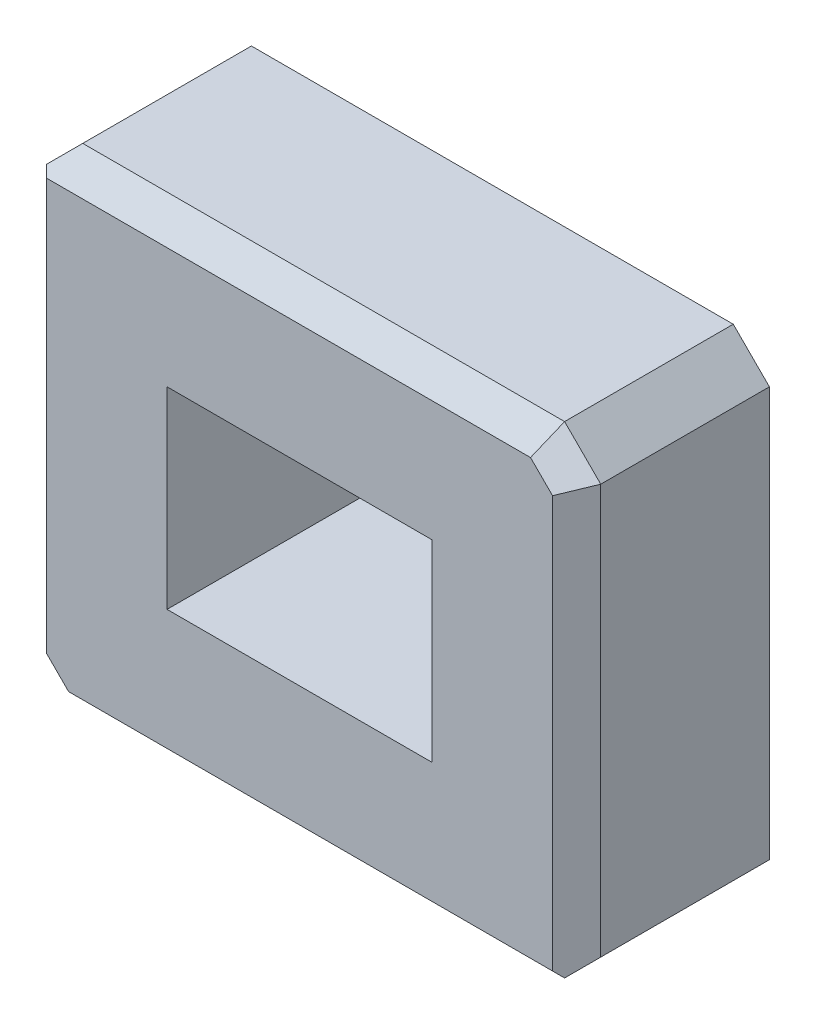
ISO-10303-21;
HEADER;
FILE_DESCRIPTION(('STEP AP214'),'2;1');
FILE_NAME('part.step','',(''),(''),'','','');
FILE_SCHEMA(('AUTOMOTIVE_DESIGN { 1 0 10303 214 1 1 1 1 }'));
ENDSEC;
DATA;
#1=APPLICATION_CONTEXT('core data for automotive mechanical design processes');
#2=APPLICATION_PROTOCOL_DEFINITION('international standard','automotive_design',2000,#1);
#3=PRODUCT_CONTEXT('',#1,'mechanical');
#4=PRODUCT('Part','Part','',(#3));
#5=PRODUCT_RELATED_PRODUCT_CATEGORY('part','',(#4));
#6=PRODUCT_DEFINITION_FORMATION('','',#4);
#7=PRODUCT_DEFINITION_CONTEXT('part definition',#1,'design');
#8=PRODUCT_DEFINITION('design','',#6,#7);
#9=PRODUCT_DEFINITION_SHAPE('','',#8);
#10=(LENGTH_UNIT() NAMED_UNIT(*) SI_UNIT(.MILLI.,.METRE.));
#11=(NAMED_UNIT(*) PLANE_ANGLE_UNIT() SI_UNIT($,.RADIAN.));
#12=(NAMED_UNIT(*) SI_UNIT($,.STERADIAN.) SOLID_ANGLE_UNIT());
#13=UNCERTAINTY_MEASURE_WITH_UNIT(LENGTH_MEASURE(1.E-05),#10,'distance_accuracy_value','');
#14=(GEOMETRIC_REPRESENTATION_CONTEXT(3) GLOBAL_UNCERTAINTY_ASSIGNED_CONTEXT((#13)) GLOBAL_UNIT_ASSIGNED_CONTEXT((#10,
#11,#12)) REPRESENTATION_CONTEXT('',''));
#15=CARTESIAN_POINT('',(0.,0.,0.));
#16=DIRECTION('',(0.,0.,1.));
#17=DIRECTION('',(1.,0.,0.));
#18=AXIS2_PLACEMENT_3D('',#15,#16,#17);
#19=CARTESIAN_POINT('',(-11.5,-8.5,8.));
#20=DIRECTION('',(1.,0.,0.));
#21=DIRECTION('',(0.,0.,-1.));
#22=AXIS2_PLACEMENT_3D('',#19,#20,#21);
#23=PLANE('',#22);
#24=DIRECTION('',(0.,0.,-1.));
#25=VECTOR('',#24,1.);
#26=CARTESIAN_POINT('',(-11.5,-8.5,8.));
#27=LINE('',#26,#25);
#28=CARTESIAN_POINT('',(-11.5,-8.5,7.));
#29=VERTEX_POINT('',#28);
#30=CARTESIAN_POINT('',(-11.5,-8.5,0.));
#31=VERTEX_POINT('',#30);
#32=EDGE_CURVE('E231',#29,#31,#27,.T.);
#33=ORIENTED_EDGE('',*,*,#32,.F.);
#34=DIRECTION('',(0.,1.,0.));
#35=VECTOR('',#34,1.);
#36=CARTESIAN_POINT('',(-11.5,-8.5,7.));
#37=LINE('',#36,#35);
#38=CARTESIAN_POINT('',(-11.5,8.5,7.));
#39=VERTEX_POINT('',#38);
#40=EDGE_CURVE('E246',#29,#39,#37,.T.);
#41=ORIENTED_EDGE('',*,*,#40,.T.);
#42=DIRECTION('',(0.,0.,-1.));
#43=VECTOR('',#42,1.);
#44=CARTESIAN_POINT('',(-11.5,8.5,8.));
#45=LINE('',#44,#43);
#46=CARTESIAN_POINT('',(-11.5,8.5,0.));
#47=VERTEX_POINT('',#46);
#48=EDGE_CURVE('E217',#39,#47,#45,.T.);
#49=ORIENTED_EDGE('',*,*,#48,.T.);
#50=DIRECTION('',(0.,-1.,0.));
#51=VECTOR('',#50,1.);
#52=CARTESIAN_POINT('',(-11.5,-8.5,0.));
#53=LINE('',#52,#51);
#54=EDGE_CURVE('E190',#47,#31,#53,.T.);
#55=ORIENTED_EDGE('',*,*,#54,.T.);
#56=EDGE_LOOP('',(#33,#41,#49,#55));
#57=FACE_BOUND('',#56,.T.);
#58=ADVANCED_FACE('F36',(#57),#23,.F.);
#59=CARTESIAN_POINT('',(-11.5,-8.5,8.));
#60=DIRECTION('',(0.707106781186547,0.707106781186547,0.));
#61=DIRECTION('',(-0.707106781186548,0.707106781186548,0.));
#62=AXIS2_PLACEMENT_3D('',#59,#60,#61);
#63=PLANE('',#62);
#64=DIRECTION('',(0.,0.,-1.));
#65=VECTOR('',#64,1.);
#66=CARTESIAN_POINT('',(-10.,-10.,8.));
#67=LINE('',#66,#65);
#68=CARTESIAN_POINT('',(-10.,-10.,7.));
#69=VERTEX_POINT('',#68);
#70=CARTESIAN_POINT('',(-10.,-10.,0.));
#71=VERTEX_POINT('',#70);
#72=EDGE_CURVE('E229',#69,#71,#67,.T.);
#73=ORIENTED_EDGE('',*,*,#72,.F.);
#74=DIRECTION('',(-0.707106781186548,0.707106781186548,0.));
#75=VECTOR('',#74,1.);
#76=CARTESIAN_POINT('',(-11.5,-8.5,7.));
#77=LINE('',#76,#75);
#78=EDGE_CURVE('E253',#69,#29,#77,.T.);
#79=ORIENTED_EDGE('',*,*,#78,.T.);
#80=ORIENTED_EDGE('',*,*,#32,.T.);
#81=DIRECTION('',(0.707106781186548,-0.707106781186548,0.));
#82=VECTOR('',#81,1.);
#83=CARTESIAN_POINT('',(-11.5,-8.5,0.));
#84=LINE('',#83,#82);
#85=EDGE_CURVE('E196',#31,#71,#84,.T.);
#86=ORIENTED_EDGE('',*,*,#85,.T.);
#87=EDGE_LOOP('',(#73,#79,#80,#86));
#88=FACE_BOUND('',#87,.T.);
#89=ADVANCED_FACE('F332',(#88),#63,.F.);
#90=CARTESIAN_POINT('',(-10.,-10.,8.));
#91=DIRECTION('',(0.,1.,0.));
#92=DIRECTION('',(0.,0.,1.));
#93=AXIS2_PLACEMENT_3D('',#90,#91,#92);
#94=PLANE('',#93);
#95=DIRECTION('',(0.,0.,-1.));
#96=VECTOR('',#95,1.);
#97=CARTESIAN_POINT('',(10.,-10.,8.));
#98=LINE('',#97,#96);
#99=CARTESIAN_POINT('',(10.,-10.,7.));
#100=VERTEX_POINT('',#99);
#101=CARTESIAN_POINT('',(10.,-10.,0.));
#102=VERTEX_POINT('',#101);
#103=EDGE_CURVE('E227',#100,#102,#98,.T.);
#104=ORIENTED_EDGE('',*,*,#103,.F.);
#105=DIRECTION('',(-1.,0.,0.));
#106=VECTOR('',#105,1.);
#107=CARTESIAN_POINT('',(-10.,-10.,7.));
#108=LINE('',#107,#106);
#109=EDGE_CURVE('E259',#100,#69,#108,.T.);
#110=ORIENTED_EDGE('',*,*,#109,.T.);
#111=ORIENTED_EDGE('',*,*,#72,.T.);
#112=DIRECTION('',(1.,0.,0.));
#113=VECTOR('',#112,1.);
#114=CARTESIAN_POINT('',(-10.,-10.,0.));
#115=LINE('',#114,#113);
#116=EDGE_CURVE('E199',#71,#102,#115,.T.);
#117=ORIENTED_EDGE('',*,*,#116,.T.);
#118=EDGE_LOOP('',(#104,#110,#111,#117));
#119=FACE_BOUND('',#118,.T.);
#120=ADVANCED_FACE('F339',(#119),#94,.F.);
#121=CARTESIAN_POINT('',(10.,-10.,8.));
#122=DIRECTION('',(-0.707106781186547,0.707106781186547,0.));
#123=DIRECTION('',(-0.707106781186548,-0.707106781186548,0.));
#124=AXIS2_PLACEMENT_3D('',#121,#122,#123);
#125=PLANE('',#124);
#126=DIRECTION('',(0.577350269189626,0.577350269189626,-0.577350269189626));
#127=VECTOR('',#126,1.);
#128=CARTESIAN_POINT('',(13.6666666666667,-6.33333333333334,4.83333333333333));
#129=LINE('',#128,#127);
#130=CARTESIAN_POINT('',(11.5,-8.5,6.99999999999999));
#131=VERTEX_POINT('',#130);
#132=CARTESIAN_POINT('',(10.75,-9.25000000000001,7.74999999999999));
#133=VERTEX_POINT('',#132);
#134=EDGE_CURVE('E255',#131,#133,#129,.F.);
#135=ORIENTED_EDGE('',*,*,#134,.T.);
#136=DIRECTION('',(0.577350269189625,0.577350269189625,0.577350269189627));
#137=VECTOR('',#136,1.);
#138=CARTESIAN_POINT('',(7.33333333333334,-12.6666666666667,4.33333333333333));
#139=LINE('',#138,#137);
#140=EDGE_CURVE('E257',#133,#100,#139,.F.);
#141=ORIENTED_EDGE('',*,*,#140,.T.);
#142=ORIENTED_EDGE('',*,*,#103,.T.);
#143=DIRECTION('',(0.707106781186548,0.707106781186548,0.));
#144=VECTOR('',#143,1.);
#145=CARTESIAN_POINT('',(10.,-10.,0.));
#146=LINE('',#145,#144);
#147=CARTESIAN_POINT('',(11.5,-8.5,0.));
#148=VERTEX_POINT('',#147);
#149=EDGE_CURVE('E202',#102,#148,#146,.T.);
#150=ORIENTED_EDGE('',*,*,#149,.T.);
#151=DIRECTION('',(0.,0.,-1.));
#152=VECTOR('',#151,1.);
#153=CARTESIAN_POINT('',(11.5,-8.5,8.));
#154=LINE('',#153,#152);
#155=EDGE_CURVE('E225',#131,#148,#154,.T.);
#156=ORIENTED_EDGE('',*,*,#155,.F.);
#157=EDGE_LOOP('',(#135,#141,#142,#150,#156));
#158=FACE_BOUND('',#157,.T.);
#159=ADVANCED_FACE('F294',(#158),#125,.F.);
#160=CARTESIAN_POINT('',(11.5,-8.5,8.));
#161=DIRECTION('',(-1.,0.,0.));
#162=DIRECTION('',(0.,0.,1.));
#163=AXIS2_PLACEMENT_3D('',#160,#161,#162);
#164=PLANE('',#163);
#165=DIRECTION('',(0.,0.,-1.));
#166=VECTOR('',#165,1.);
#167=CARTESIAN_POINT('',(11.5,8.5,8.));
#168=LINE('',#167,#166);
#169=CARTESIAN_POINT('',(11.5,8.5,6.99999999999999));
#170=VERTEX_POINT('',#169);
#171=CARTESIAN_POINT('',(11.5,8.5,0.));
#172=VERTEX_POINT('',#171);
#173=EDGE_CURVE('E223',#170,#172,#168,.T.);
#174=ORIENTED_EDGE('',*,*,#173,.F.);
#175=DIRECTION('',(0.,-1.,0.));
#176=VECTOR('',#175,1.);
#177=CARTESIAN_POINT('',(11.5,-8.5,6.99999999999999));
#178=LINE('',#177,#176);
#179=EDGE_CURVE('E261',#170,#131,#178,.T.);
#180=ORIENTED_EDGE('',*,*,#179,.T.);
#181=ORIENTED_EDGE('',*,*,#155,.T.);
#182=DIRECTION('',(0.,1.,0.));
#183=VECTOR('',#182,1.);
#184=CARTESIAN_POINT('',(11.5,-8.5,0.));
#185=LINE('',#184,#183);
#186=EDGE_CURVE('E205',#148,#172,#185,.T.);
#187=ORIENTED_EDGE('',*,*,#186,.T.);
#188=EDGE_LOOP('',(#174,#180,#181,#187));
#189=FACE_BOUND('',#188,.T.);
#190=ADVANCED_FACE('F292',(#189),#164,.F.);
#191=CARTESIAN_POINT('',(10.,10.,8.));
#192=DIRECTION('',(-0.707106781186547,-0.707106781186547,0.));
#193=DIRECTION('',(0.707106781186548,-0.707106781186548,0.));
#194=AXIS2_PLACEMENT_3D('',#191,#192,#193);
#195=PLANE('',#194);
#196=DIRECTION('',(0.,0.,-1.));
#197=VECTOR('',#196,1.);
#198=CARTESIAN_POINT('',(10.,10.,8.));
#199=LINE('',#198,#197);
#200=CARTESIAN_POINT('',(10.,10.,6.99999999999999));
#201=VERTEX_POINT('',#200);
#202=CARTESIAN_POINT('',(10.,10.,0.));
#203=VERTEX_POINT('',#202);
#204=EDGE_CURVE('E221',#201,#203,#199,.T.);
#205=ORIENTED_EDGE('',*,*,#204,.F.);
#206=DIRECTION('',(0.707106781186548,-0.707106781186548,0.));
#207=VECTOR('',#206,1.);
#208=CARTESIAN_POINT('',(10.,10.,6.99999999999999));
#209=LINE('',#208,#207);
#210=EDGE_CURVE('E46',#201,#170,#209,.T.);
#211=ORIENTED_EDGE('',*,*,#210,.T.);
#212=ORIENTED_EDGE('',*,*,#173,.T.);
#213=DIRECTION('',(-0.707106781186548,0.707106781186548,0.));
#214=VECTOR('',#213,1.);
#215=CARTESIAN_POINT('',(10.,10.,0.));
#216=LINE('',#215,#214);
#217=EDGE_CURVE('E208',#172,#203,#216,.T.);
#218=ORIENTED_EDGE('',*,*,#217,.T.);
#219=EDGE_LOOP('',(#205,#211,#212,#218));
#220=FACE_BOUND('',#219,.T.);
#221=ADVANCED_FACE('F303',(#220),#195,.F.);
#222=CARTESIAN_POINT('',(-10.,10.,8.));
#223=DIRECTION('',(0.,-1.,0.));
#224=DIRECTION('',(0.,0.,-1.));
#225=AXIS2_PLACEMENT_3D('',#222,#223,#224);
#226=PLANE('',#225);
#227=DIRECTION('',(0.,0.,-1.));
#228=VECTOR('',#227,1.);
#229=CARTESIAN_POINT('',(-10.,10.,8.));
#230=LINE('',#229,#228);
#231=CARTESIAN_POINT('',(-10.,10.,6.99999999999999));
#232=VERTEX_POINT('',#231);
#233=CARTESIAN_POINT('',(-10.,10.,0.));
#234=VERTEX_POINT('',#233);
#235=EDGE_CURVE('E219',#232,#234,#230,.T.);
#236=ORIENTED_EDGE('',*,*,#235,.F.);
#237=DIRECTION('',(1.,0.,0.));
#238=VECTOR('',#237,1.);
#239=CARTESIAN_POINT('',(-10.,10.,6.99999999999999));
#240=LINE('',#239,#238);
#241=EDGE_CURVE('E11',#232,#201,#240,.T.);
#242=ORIENTED_EDGE('',*,*,#241,.T.);
#243=ORIENTED_EDGE('',*,*,#204,.T.);
#244=DIRECTION('',(-1.,0.,0.));
#245=VECTOR('',#244,1.);
#246=CARTESIAN_POINT('',(-10.,10.,0.));
#247=LINE('',#246,#245);
#248=EDGE_CURVE('E211',#203,#234,#247,.T.);
#249=ORIENTED_EDGE('',*,*,#248,.T.);
#250=EDGE_LOOP('',(#236,#242,#243,#249));
#251=FACE_BOUND('',#250,.T.);
#252=ADVANCED_FACE('F304',(#251),#226,.F.);
#253=CARTESIAN_POINT('',(-11.5,8.5,8.));
#254=DIRECTION('',(0.707106781186547,-0.707106781186547,0.));
#255=DIRECTION('',(0.707106781186548,0.707106781186548,0.));
#256=AXIS2_PLACEMENT_3D('',#253,#254,#255);
#257=PLANE('',#256);
#258=ORIENTED_EDGE('',*,*,#48,.F.);
#259=DIRECTION('',(-0.577350269189625,-0.577350269189625,-0.577350269189627));
#260=VECTOR('',#259,1.);
#261=CARTESIAN_POINT('',(-13.6666666666667,6.33333333333334,4.83333333333333));
#262=LINE('',#261,#260);
#263=CARTESIAN_POINT('',(-10.75,9.25,7.75));
#264=VERTEX_POINT('',#263);
#265=EDGE_CURVE('E251',#39,#264,#262,.F.);
#266=ORIENTED_EDGE('',*,*,#265,.T.);
#267=DIRECTION('',(-0.577350269189626,-0.577350269189626,0.577350269189626));
#268=VECTOR('',#267,1.);
#269=CARTESIAN_POINT('',(-7.33333333333334,12.6666666666667,4.33333333333333));
#270=LINE('',#269,#268);
#271=EDGE_CURVE('E249',#264,#232,#270,.F.);
#272=ORIENTED_EDGE('',*,*,#271,.T.);
#273=ORIENTED_EDGE('',*,*,#235,.T.);
#274=DIRECTION('',(-0.707106781186548,-0.707106781186548,0.));
#275=VECTOR('',#274,1.);
#276=CARTESIAN_POINT('',(-11.5,8.5,0.));
#277=LINE('',#276,#275);
#278=EDGE_CURVE('E214',#234,#47,#277,.T.);
#279=ORIENTED_EDGE('',*,*,#278,.T.);
#280=EDGE_LOOP('',(#258,#266,#272,#273,#279));
#281=FACE_BOUND('',#280,.T.);
#282=ADVANCED_FACE('F308',(#281),#257,.F.);
#283=CARTESIAN_POINT('',(0.,0.,8.));
#284=DIRECTION('',(0.,0.,-1.));
#285=DIRECTION('',(-1.,0.,0.));
#286=AXIS2_PLACEMENT_3D('',#283,#284,#285);
#287=PLANE('',#286);
#288=DIRECTION('',(-1.,0.,0.));
#289=VECTOR('',#288,1.);
#290=CARTESIAN_POINT('',(0.,8.99999999999999,8.));
#291=LINE('',#290,#289);
#292=CARTESIAN_POINT('',(9.5857864376269,8.99999999999999,8.));
#293=VERTEX_POINT('',#292);
#294=CARTESIAN_POINT('',(-10.5,8.99999999999999,8.));
#295=VERTEX_POINT('',#294);
#296=EDGE_CURVE('E233',#293,#295,#291,.T.);
#297=ORIENTED_EDGE('',*,*,#296,.T.);
#298=DIRECTION('',(0.,-1.,0.));
#299=VECTOR('',#298,1.);
#300=CARTESIAN_POINT('',(-10.5,0.,8.));
#301=LINE('',#300,#299);
#302=CARTESIAN_POINT('',(-10.5,-8.08578643762691,8.));
#303=VERTEX_POINT('',#302);
#304=EDGE_CURVE('E243',#295,#303,#301,.T.);
#305=ORIENTED_EDGE('',*,*,#304,.T.);
#306=DIRECTION('',(0.707106781186548,-0.707106781186548,0.));
#307=VECTOR('',#306,1.);
#308=CARTESIAN_POINT('',(-9.29289321881345,-9.29289321881345,8.));
#309=LINE('',#308,#307);
#310=CARTESIAN_POINT('',(-9.58578643762691,-9.,8.));
#311=VERTEX_POINT('',#310);
#312=EDGE_CURVE('E241',#303,#311,#309,.T.);
#313=ORIENTED_EDGE('',*,*,#312,.T.);
#314=DIRECTION('',(1.,0.,0.));
#315=VECTOR('',#314,1.);
#316=CARTESIAN_POINT('',(0.,-9.,8.));
#317=LINE('',#316,#315);
#318=CARTESIAN_POINT('',(10.5,-9.,8.));
#319=VERTEX_POINT('',#318);
#320=EDGE_CURVE('E239',#311,#319,#317,.T.);
#321=ORIENTED_EDGE('',*,*,#320,.T.);
#322=DIRECTION('',(0.,1.,0.));
#323=VECTOR('',#322,1.);
#324=CARTESIAN_POINT('',(10.5,0.,8.));
#325=LINE('',#324,#323);
#326=CARTESIAN_POINT('',(10.5,8.0857864376269,8.));
#327=VERTEX_POINT('',#326);
#328=EDGE_CURVE('E237',#319,#327,#325,.T.);
#329=ORIENTED_EDGE('',*,*,#328,.T.);
#330=DIRECTION('',(-0.707106781186548,0.707106781186548,0.));
#331=VECTOR('',#330,1.);
#332=CARTESIAN_POINT('',(9.29289321881344,9.29289321881344,8.));
#333=LINE('',#332,#331);
#334=EDGE_CURVE('E235',#327,#293,#333,.T.);
#335=ORIENTED_EDGE('',*,*,#334,.T.);
#336=EDGE_LOOP('',(#297,#305,#313,#321,#329,#335));
#337=FACE_BOUND('',#336,.T.);
#338=DIRECTION('',(-1.,0.,0.));
#339=VECTOR('',#338,1.);
#340=CARTESIAN_POINT('',(-5.5,4.,8.));
#341=LINE('',#340,#339);
#342=CARTESIAN_POINT('',(5.5,4.,8.));
#343=VERTEX_POINT('',#342);
#344=CARTESIAN_POINT('',(-5.5,4.,8.));
#345=VERTEX_POINT('',#344);
#346=EDGE_CURVE('E184',#343,#345,#341,.T.);
#347=ORIENTED_EDGE('',*,*,#346,.F.);
#348=DIRECTION('',(0.,1.,0.));
#349=VECTOR('',#348,1.);
#350=CARTESIAN_POINT('',(5.5,-4.,8.));
#351=LINE('',#350,#349);
#352=CARTESIAN_POINT('',(5.5,-4.,8.));
#353=VERTEX_POINT('',#352);
#354=EDGE_CURVE('E157',#353,#343,#351,.T.);
#355=ORIENTED_EDGE('',*,*,#354,.F.);
#356=DIRECTION('',(1.,0.,0.));
#357=VECTOR('',#356,1.);
#358=CARTESIAN_POINT('',(-5.5,-4.,8.));
#359=LINE('',#358,#357);
#360=CARTESIAN_POINT('',(-5.5,-4.,8.));
#361=VERTEX_POINT('',#360);
#362=EDGE_CURVE('E175',#361,#353,#359,.T.);
#363=ORIENTED_EDGE('',*,*,#362,.F.);
#364=DIRECTION('',(0.,-1.,0.));
#365=VECTOR('',#364,1.);
#366=CARTESIAN_POINT('',(-5.5,-4.,8.));
#367=LINE('',#366,#365);
#368=EDGE_CURVE('E178',#345,#361,#367,.T.);
#369=ORIENTED_EDGE('',*,*,#368,.F.);
#370=EDGE_LOOP('',(#347,#355,#363,#369));
#371=FACE_BOUND('',#370,.T.);
#372=ADVANCED_FACE('F321',(#337,#371),#287,.F.);
#373=CARTESIAN_POINT('',(0.,0.,0.));
#374=DIRECTION('',(0.,0.,-1.));
#375=DIRECTION('',(-1.,0.,0.));
#376=AXIS2_PLACEMENT_3D('',#373,#374,#375);
#377=PLANE('',#376);
#378=DIRECTION('',(0.,1.,0.));
#379=VECTOR('',#378,1.);
#380=CARTESIAN_POINT('',(5.5,-4.,0.));
#381=LINE('',#380,#379);
#382=CARTESIAN_POINT('',(5.5,-4.,0.));
#383=VERTEX_POINT('',#382);
#384=CARTESIAN_POINT('',(5.5,4.,0.));
#385=VERTEX_POINT('',#384);
#386=EDGE_CURVE('E154',#383,#385,#381,.T.);
#387=ORIENTED_EDGE('',*,*,#386,.T.);
#388=DIRECTION('',(-1.,0.,0.));
#389=VECTOR('',#388,1.);
#390=CARTESIAN_POINT('',(-5.5,4.,0.));
#391=LINE('',#390,#389);
#392=CARTESIAN_POINT('',(-5.5,4.,0.));
#393=VERTEX_POINT('',#392);
#394=EDGE_CURVE('E166',#385,#393,#391,.T.);
#395=ORIENTED_EDGE('',*,*,#394,.T.);
#396=DIRECTION('',(0.,-1.,0.));
#397=VECTOR('',#396,1.);
#398=CARTESIAN_POINT('',(-5.5,-4.,0.));
#399=LINE('',#398,#397);
#400=CARTESIAN_POINT('',(-5.5,-4.,0.));
#401=VERTEX_POINT('',#400);
#402=EDGE_CURVE('E170',#393,#401,#399,.T.);
#403=ORIENTED_EDGE('',*,*,#402,.T.);
#404=DIRECTION('',(1.,0.,0.));
#405=VECTOR('',#404,1.);
#406=CARTESIAN_POINT('',(-5.5,-4.,0.));
#407=LINE('',#406,#405);
#408=EDGE_CURVE('E162',#401,#383,#407,.T.);
#409=ORIENTED_EDGE('',*,*,#408,.T.);
#410=EDGE_LOOP('',(#387,#395,#403,#409));
#411=FACE_BOUND('',#410,.T.);
#412=ORIENTED_EDGE('',*,*,#54,.F.);
#413=ORIENTED_EDGE('',*,*,#278,.F.);
#414=ORIENTED_EDGE('',*,*,#248,.F.);
#415=ORIENTED_EDGE('',*,*,#217,.F.);
#416=ORIENTED_EDGE('',*,*,#186,.F.);
#417=ORIENTED_EDGE('',*,*,#149,.F.);
#418=ORIENTED_EDGE('',*,*,#116,.F.);
#419=ORIENTED_EDGE('',*,*,#85,.F.);
#420=EDGE_LOOP('',(#412,#413,#414,#415,#416,#417,#418,#419));
#421=FACE_BOUND('',#420,.T.);
#422=ADVANCED_FACE('F172',(#411,#421),#377,.T.);
#423=CARTESIAN_POINT('',(5.5,-4.,0.));
#424=DIRECTION('',(1.,0.,0.));
#425=DIRECTION('',(0.,0.,-1.));
#426=AXIS2_PLACEMENT_3D('',#423,#424,#425);
#427=PLANE('',#426);
#428=ORIENTED_EDGE('',*,*,#354,.T.);
#429=DIRECTION('',(0.,0.,1.));
#430=VECTOR('',#429,1.);
#431=CARTESIAN_POINT('',(5.5,4.,0.));
#432=LINE('',#431,#430);
#433=EDGE_CURVE('E150',#385,#343,#432,.T.);
#434=ORIENTED_EDGE('',*,*,#433,.F.);
#435=ORIENTED_EDGE('',*,*,#386,.F.);
#436=DIRECTION('',(0.,0.,1.));
#437=VECTOR('',#436,1.);
#438=CARTESIAN_POINT('',(5.5,-4.,0.));
#439=LINE('',#438,#437);
#440=EDGE_CURVE('E188',#383,#353,#439,.T.);
#441=ORIENTED_EDGE('',*,*,#440,.T.);
#442=EDGE_LOOP('',(#428,#434,#435,#441));
#443=FACE_BOUND('',#442,.T.);
#444=ADVANCED_FACE('F152',(#443),#427,.F.);
#445=CARTESIAN_POINT('',(-5.5,-4.,0.));
#446=DIRECTION('',(0.,-1.,0.));
#447=DIRECTION('',(0.,0.,-1.));
#448=AXIS2_PLACEMENT_3D('',#445,#446,#447);
#449=PLANE('',#448);
#450=ORIENTED_EDGE('',*,*,#362,.T.);
#451=ORIENTED_EDGE('',*,*,#440,.F.);
#452=ORIENTED_EDGE('',*,*,#408,.F.);
#453=DIRECTION('',(0.,0.,1.));
#454=VECTOR('',#453,1.);
#455=CARTESIAN_POINT('',(-5.5,-4.,0.));
#456=LINE('',#455,#454);
#457=EDGE_CURVE('E191',#401,#361,#456,.T.);
#458=ORIENTED_EDGE('',*,*,#457,.T.);
#459=EDGE_LOOP('',(#450,#451,#452,#458));
#460=FACE_BOUND('',#459,.T.);
#461=ADVANCED_FACE('F377',(#460),#449,.F.);
#462=CARTESIAN_POINT('',(-5.5,-4.,0.));
#463=DIRECTION('',(-1.,0.,0.));
#464=DIRECTION('',(0.,0.,1.));
#465=AXIS2_PLACEMENT_3D('',#462,#463,#464);
#466=PLANE('',#465);
#467=ORIENTED_EDGE('',*,*,#368,.T.);
#468=ORIENTED_EDGE('',*,*,#457,.F.);
#469=ORIENTED_EDGE('',*,*,#402,.F.);
#470=DIRECTION('',(0.,0.,1.));
#471=VECTOR('',#470,1.);
#472=CARTESIAN_POINT('',(-5.5,4.,0.));
#473=LINE('',#472,#471);
#474=EDGE_CURVE('E161',#393,#345,#473,.T.);
#475=ORIENTED_EDGE('',*,*,#474,.T.);
#476=EDGE_LOOP('',(#467,#468,#469,#475));
#477=FACE_BOUND('',#476,.T.);
#478=ADVANCED_FACE('F372',(#477),#466,.F.);
#479=CARTESIAN_POINT('',(-5.5,4.,0.));
#480=DIRECTION('',(0.,1.,0.));
#481=DIRECTION('',(0.,0.,1.));
#482=AXIS2_PLACEMENT_3D('',#479,#480,#481);
#483=PLANE('',#482);
#484=ORIENTED_EDGE('',*,*,#346,.T.);
#485=ORIENTED_EDGE('',*,*,#474,.F.);
#486=ORIENTED_EDGE('',*,*,#394,.F.);
#487=ORIENTED_EDGE('',*,*,#433,.T.);
#488=EDGE_LOOP('',(#484,#485,#486,#487));
#489=FACE_BOUND('',#488,.T.);
#490=ADVANCED_FACE('F167',(#489),#483,.F.);
#491=CARTESIAN_POINT('',(10.5,0.,8.));
#492=DIRECTION('',(-0.707106781186547,0.,-0.707106781186547));
#493=DIRECTION('',(0.,1.,0.));
#494=AXIS2_PLACEMENT_3D('',#491,#492,#493);
#495=PLANE('',#494);
#496=ORIENTED_EDGE('',*,*,#134,.F.);
#497=ORIENTED_EDGE('',*,*,#179,.F.);
#498=DIRECTION('',(0.678598344545847,0.281084637714821,-0.678598344545847));
#499=VECTOR('',#498,1.);
#500=CARTESIAN_POINT('',(10.1743803584745,7.95091036593199,8.32561964152545));
#501=LINE('',#500,#499);
#502=EDGE_CURVE('E41',#327,#170,#501,.T.);
#503=ORIENTED_EDGE('',*,*,#502,.F.);
#504=ORIENTED_EDGE('',*,*,#328,.F.);
#505=DIRECTION('',(0.577350269189626,-0.577350269189624,-0.577350269189626));
#506=VECTOR('',#505,1.);
#507=CARTESIAN_POINT('',(7.49999999999999,-6.00000000000001,11.));
#508=LINE('',#507,#506);
#509=EDGE_CURVE('E274',#133,#319,#508,.F.);
#510=ORIENTED_EDGE('',*,*,#509,.F.);
#511=EDGE_LOOP('',(#496,#497,#503,#504,#510));
#512=FACE_BOUND('',#511,.T.);
#513=ADVANCED_FACE('F39',(#512),#495,.F.);
#514=CARTESIAN_POINT('',(9.29289321881344,9.29289321881344,8.));
#515=DIRECTION('',(-0.5,-0.5,-0.707106781186548));
#516=DIRECTION('',(-0.707106781186548,0.707106781186548,0.));
#517=AXIS2_PLACEMENT_3D('',#514,#515,#516);
#518=PLANE('',#517);
#519=ORIENTED_EDGE('',*,*,#502,.T.);
#520=ORIENTED_EDGE('',*,*,#210,.F.);
#521=DIRECTION('',(0.281084637714821,0.678598344545847,-0.678598344545847));
#522=VECTOR('',#521,1.);
#523=CARTESIAN_POINT('',(8.82842712474618,7.1715728752538,9.8284271247462));
#524=LINE('',#523,#522);
#525=EDGE_CURVE('E272',#293,#201,#524,.T.);
#526=ORIENTED_EDGE('',*,*,#525,.F.);
#527=ORIENTED_EDGE('',*,*,#334,.F.);
#528=EDGE_LOOP('',(#519,#520,#526,#527));
#529=FACE_BOUND('',#528,.T.);
#530=ADVANCED_FACE('F284',(#529),#518,.F.);
#531=CARTESIAN_POINT('',(0.,-9.,8.));
#532=DIRECTION('',(0.,0.707106781186549,-0.707106781186546));
#533=DIRECTION('',(1.,0.,0.));
#534=AXIS2_PLACEMENT_3D('',#531,#532,#533);
#535=PLANE('',#534);
#536=ORIENTED_EDGE('',*,*,#509,.T.);
#537=ORIENTED_EDGE('',*,*,#320,.F.);
#538=DIRECTION('',(-0.28108463771482,-0.678598344545846,-0.678598344545848));
#539=VECTOR('',#538,1.);
#540=CARTESIAN_POINT('',(-8.82842712474619,-7.17157287525381,9.8284271247462));
#541=LINE('',#540,#539);
#542=EDGE_CURVE('E269',#69,#311,#541,.F.);
#543=ORIENTED_EDGE('',*,*,#542,.F.);
#544=ORIENTED_EDGE('',*,*,#109,.F.);
#545=ORIENTED_EDGE('',*,*,#140,.F.);
#546=EDGE_LOOP('',(#536,#537,#543,#544,#545));
#547=FACE_BOUND('',#546,.T.);
#548=ADVANCED_FACE('F324',(#547),#535,.F.);
#549=CARTESIAN_POINT('',(0.,8.99999999999999,8.));
#550=DIRECTION('',(0.,-0.707106781186547,-0.707106781186547));
#551=DIRECTION('',(-1.,0.,0.));
#552=AXIS2_PLACEMENT_3D('',#549,#550,#551);
#553=PLANE('',#552);
#554=ORIENTED_EDGE('',*,*,#241,.F.);
#555=ORIENTED_EDGE('',*,*,#271,.F.);
#556=DIRECTION('',(-0.577350269189624,0.577350269189626,-0.577350269189626));
#557=VECTOR('',#556,1.);
#558=CARTESIAN_POINT('',(-7.50000000000001,5.99999999999999,11.));
#559=LINE('',#558,#557);
#560=EDGE_CURVE('E266',#295,#264,#559,.T.);
#561=ORIENTED_EDGE('',*,*,#560,.F.);
#562=ORIENTED_EDGE('',*,*,#296,.F.);
#563=ORIENTED_EDGE('',*,*,#525,.T.);
#564=EDGE_LOOP('',(#554,#555,#561,#562,#563));
#565=FACE_BOUND('',#564,.T.);
#566=ADVANCED_FACE('F312',(#565),#553,.F.);
#567=CARTESIAN_POINT('',(-9.29289321881345,-9.29289321881345,8.));
#568=DIRECTION('',(0.500000000000001,0.500000000000001,-0.707106781186546));
#569=DIRECTION('',(0.707106781186548,-0.707106781186548,0.));
#570=AXIS2_PLACEMENT_3D('',#567,#568,#569);
#571=PLANE('',#570);
#572=ORIENTED_EDGE('',*,*,#542,.T.);
#573=ORIENTED_EDGE('',*,*,#312,.F.);
#574=DIRECTION('',(-0.678598344545846,-0.28108463771482,-0.678598344545848));
#575=VECTOR('',#574,1.);
#576=CARTESIAN_POINT('',(-10.1743803584745,-7.950910365932,8.32561964152545));
#577=LINE('',#576,#575);
#578=EDGE_CURVE('E264',#29,#303,#577,.F.);
#579=ORIENTED_EDGE('',*,*,#578,.F.);
#580=ORIENTED_EDGE('',*,*,#78,.F.);
#581=EDGE_LOOP('',(#572,#573,#579,#580));
#582=FACE_BOUND('',#581,.T.);
#583=ADVANCED_FACE('F328',(#582),#571,.F.);
#584=CARTESIAN_POINT('',(-10.5,0.,8.));
#585=DIRECTION('',(0.707106781186549,0.,-0.707106781186546));
#586=DIRECTION('',(0.,-1.,0.));
#587=AXIS2_PLACEMENT_3D('',#584,#585,#586);
#588=PLANE('',#587);
#589=ORIENTED_EDGE('',*,*,#265,.F.);
#590=ORIENTED_EDGE('',*,*,#40,.F.);
#591=ORIENTED_EDGE('',*,*,#578,.T.);
#592=ORIENTED_EDGE('',*,*,#304,.F.);
#593=ORIENTED_EDGE('',*,*,#560,.T.);
#594=EDGE_LOOP('',(#589,#590,#591,#592,#593));
#595=FACE_BOUND('',#594,.T.);
#596=ADVANCED_FACE('F316',(#595),#588,.F.);
#597=CLOSED_SHELL('',(#58,#89,#120,#159,#190,#221,#252,#282,#372,#422,#444,#461,#478,#490,#513,
#530,#548,#566,#583,#596));
#598=MANIFOLD_SOLID_BREP('B2',#597);
#599=ADVANCED_BREP_SHAPE_REPRESENTATION('',(#18,#598),#14);
#600=SHAPE_DEFINITION_REPRESENTATION(#9,#599);
ENDSEC;
END-ISO-10303-21;
